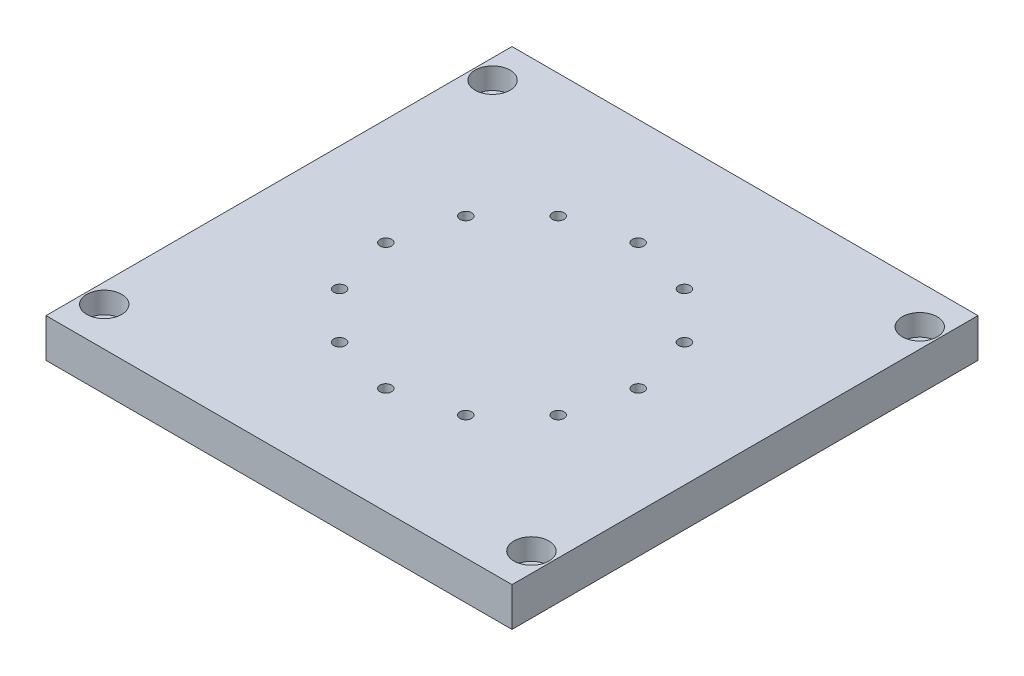
ISO-10303-21;
HEADER;
FILE_DESCRIPTION(('STEP AP214'),'2;1');
FILE_NAME('part.step','',(''),(''),'','','');
FILE_SCHEMA(('AUTOMOTIVE_DESIGN { 1 0 10303 214 1 1 1 1 }'));
ENDSEC;
DATA;
#1=APPLICATION_CONTEXT('core data for automotive mechanical design processes');
#2=APPLICATION_PROTOCOL_DEFINITION('international standard','automotive_design',2000,#1);
#3=PRODUCT_CONTEXT('',#1,'mechanical');
#4=PRODUCT('Part','Part','',(#3));
#5=PRODUCT_RELATED_PRODUCT_CATEGORY('part','',(#4));
#6=PRODUCT_DEFINITION_FORMATION('','',#4);
#7=PRODUCT_DEFINITION_CONTEXT('part definition',#1,'design');
#8=PRODUCT_DEFINITION('design','',#6,#7);
#9=PRODUCT_DEFINITION_SHAPE('','',#8);
#10=(LENGTH_UNIT() NAMED_UNIT(*) SI_UNIT(.MILLI.,.METRE.));
#11=(NAMED_UNIT(*) PLANE_ANGLE_UNIT() SI_UNIT($,.RADIAN.));
#12=(NAMED_UNIT(*) SI_UNIT($,.STERADIAN.) SOLID_ANGLE_UNIT());
#13=UNCERTAINTY_MEASURE_WITH_UNIT(LENGTH_MEASURE(1.E-05),#10,'distance_accuracy_value','');
#14=(GEOMETRIC_REPRESENTATION_CONTEXT(3) GLOBAL_UNCERTAINTY_ASSIGNED_CONTEXT((#13)) GLOBAL_UNIT_ASSIGNED_CONTEXT((#10,
#11,#12)) REPRESENTATION_CONTEXT('',''));
#15=CARTESIAN_POINT('',(0.,0.,0.));
#16=DIRECTION('',(0.,0.,1.));
#17=DIRECTION('',(1.,0.,0.));
#18=AXIS2_PLACEMENT_3D('',#15,#16,#17);
#19=CARTESIAN_POINT('',(0.,0.,0.));
#20=DIRECTION('',(0.,-1.,0.));
#21=DIRECTION('',(0.,0.,-1.));
#22=AXIS2_PLACEMENT_3D('',#19,#20,#21);
#23=PLANE('',#22);
#24=CARTESIAN_POINT('',(-56.2916512459881,0.,32.5000000000007));
#25=DIRECTION('',(0.,1.,0.));
#26=DIRECTION('',(0.,0.,1.));
#27=AXIS2_PLACEMENT_3D('',#24,#25,#26);
#28=CIRCLE('',#27,3.);
#29=CARTESIAN_POINT('',(-56.2916512459881,0.,35.5000000000007));
#30=VERTEX_POINT('',#29);
#31=EDGE_CURVE('E110',#30,#30,#28,.T.);
#32=ORIENTED_EDGE('',*,*,#31,.T.);
#33=EDGE_LOOP('',(#32));
#34=FACE_BOUND('',#33,.T.);
#35=CARTESIAN_POINT('',(-56.2916512459888,0.,-32.4999999999995));
#36=DIRECTION('',(0.,1.,0.));
#37=DIRECTION('',(0.,0.,1.));
#38=AXIS2_PLACEMENT_3D('',#35,#36,#37);
#39=CIRCLE('',#38,3.);
#40=CARTESIAN_POINT('',(-56.2916512459888,0.,-29.4999999999995));
#41=VERTEX_POINT('',#40);
#42=EDGE_CURVE('E122',#41,#41,#39,.T.);
#43=ORIENTED_EDGE('',*,*,#42,.T.);
#44=EDGE_LOOP('',(#43));
#45=FACE_BOUND('',#44,.T.);
#46=CARTESIAN_POINT('',(-32.5000000000005,0.,-56.2916512459882));
#47=DIRECTION('',(0.,1.,0.));
#48=DIRECTION('',(0.,0.,1.));
#49=AXIS2_PLACEMENT_3D('',#46,#47,#48);
#50=CIRCLE('',#49,3.);
#51=CARTESIAN_POINT('',(-32.5000000000005,0.,-53.2916512459882));
#52=VERTEX_POINT('',#51);
#53=EDGE_CURVE('E128',#52,#52,#50,.T.);
#54=ORIENTED_EDGE('',*,*,#53,.T.);
#55=EDGE_LOOP('',(#54));
#56=FACE_BOUND('',#55,.T.);
#57=CARTESIAN_POINT('',(0.,0.,-65.));
#58=DIRECTION('',(0.,1.,0.));
#59=DIRECTION('',(0.,0.,1.));
#60=AXIS2_PLACEMENT_3D('',#57,#58,#59);
#61=CIRCLE('',#60,3.);
#62=CARTESIAN_POINT('',(0.,0.,-62.));
#63=VERTEX_POINT('',#62);
#64=EDGE_CURVE('E134',#63,#63,#61,.T.);
#65=ORIENTED_EDGE('',*,*,#64,.T.);
#66=EDGE_LOOP('',(#65));
#67=FACE_BOUND('',#66,.T.);
#68=CARTESIAN_POINT('',(56.2916512459886,0.,32.5));
#69=DIRECTION('',(0.,1.,0.));
#70=DIRECTION('',(0.,0.,1.));
#71=AXIS2_PLACEMENT_3D('',#68,#69,#70);
#72=CIRCLE('',#71,3.);
#73=CARTESIAN_POINT('',(56.2916512459886,0.,35.5));
#74=VERTEX_POINT('',#73);
#75=EDGE_CURVE('E158',#74,#74,#72,.T.);
#76=ORIENTED_EDGE('',*,*,#75,.T.);
#77=EDGE_LOOP('',(#76));
#78=FACE_BOUND('',#77,.T.);
#79=CARTESIAN_POINT('',(32.5,0.,56.2916512459885));
#80=DIRECTION('',(0.,1.,0.));
#81=DIRECTION('',(0.,0.,1.));
#82=AXIS2_PLACEMENT_3D('',#79,#80,#81);
#83=CIRCLE('',#82,3.);
#84=CARTESIAN_POINT('',(32.5,0.,59.2916512459885));
#85=VERTEX_POINT('',#84);
#86=EDGE_CURVE('E164',#85,#85,#83,.T.);
#87=ORIENTED_EDGE('',*,*,#86,.T.);
#88=EDGE_LOOP('',(#87));
#89=FACE_BOUND('',#88,.T.);
#90=CARTESIAN_POINT('',(0.,0.,65.));
#91=DIRECTION('',(0.,1.,0.));
#92=DIRECTION('',(0.,0.,1.));
#93=AXIS2_PLACEMENT_3D('',#90,#91,#92);
#94=CIRCLE('',#93,3.);
#95=CARTESIAN_POINT('',(0.,0.,68.));
#96=VERTEX_POINT('',#95);
#97=EDGE_CURVE('E170',#96,#96,#94,.T.);
#98=ORIENTED_EDGE('',*,*,#97,.T.);
#99=EDGE_LOOP('',(#98));
#100=FACE_BOUND('',#99,.T.);
#101=CARTESIAN_POINT('',(110.,0.,100.));
#102=DIRECTION('',(0.,1.,0.));
#103=DIRECTION('',(0.,0.,1.));
#104=AXIS2_PLACEMENT_3D('',#101,#102,#103);
#105=CIRCLE('',#104,5.5);
#106=CARTESIAN_POINT('',(110.,0.,105.5));
#107=VERTEX_POINT('',#106);
#108=EDGE_CURVE('E182',#107,#107,#105,.T.);
#109=ORIENTED_EDGE('',*,*,#108,.T.);
#110=EDGE_LOOP('',(#109));
#111=FACE_BOUND('',#110,.T.);
#112=CARTESIAN_POINT('',(110.,0.,-100.));
#113=DIRECTION('',(0.,1.,0.));
#114=DIRECTION('',(0.,0.,1.));
#115=AXIS2_PLACEMENT_3D('',#112,#113,#114);
#116=CIRCLE('',#115,5.5);
#117=CARTESIAN_POINT('',(110.,0.,-94.5));
#118=VERTEX_POINT('',#117);
#119=EDGE_CURVE('E194',#118,#118,#116,.T.);
#120=ORIENTED_EDGE('',*,*,#119,.T.);
#121=EDGE_LOOP('',(#120));
#122=FACE_BOUND('',#121,.T.);
#123=CARTESIAN_POINT('',(-110.,0.,-100.));
#124=DIRECTION('',(0.,1.,0.));
#125=DIRECTION('',(0.,0.,1.));
#126=AXIS2_PLACEMENT_3D('',#123,#124,#125);
#127=CIRCLE('',#126,5.5);
#128=CARTESIAN_POINT('',(-110.,0.,-94.5));
#129=VERTEX_POINT('',#128);
#130=EDGE_CURVE('E206',#129,#129,#127,.T.);
#131=ORIENTED_EDGE('',*,*,#130,.T.);
#132=EDGE_LOOP('',(#131));
#133=FACE_BOUND('',#132,.T.);
#134=CARTESIAN_POINT('',(-110.,0.,100.));
#135=DIRECTION('',(0.,1.,0.));
#136=DIRECTION('',(0.,0.,1.));
#137=AXIS2_PLACEMENT_3D('',#134,#135,#136);
#138=CIRCLE('',#137,5.5);
#139=CARTESIAN_POINT('',(-110.,0.,105.5));
#140=VERTEX_POINT('',#139);
#141=EDGE_CURVE('E218',#140,#140,#138,.T.);
#142=ORIENTED_EDGE('',*,*,#141,.T.);
#143=EDGE_LOOP('',(#142));
#144=FACE_BOUND('',#143,.T.);
#145=DIRECTION('',(0.,0.,-1.));
#146=VECTOR('',#145,1.);
#147=CARTESIAN_POINT('',(120.,0.,120.));
#148=LINE('',#147,#146);
#149=CARTESIAN_POINT('',(120.,0.,120.));
#150=VERTEX_POINT('',#149);
#151=CARTESIAN_POINT('',(120.,0.,-120.));
#152=VERTEX_POINT('',#151);
#153=EDGE_CURVE('E221',#150,#152,#148,.T.);
#154=ORIENTED_EDGE('',*,*,#153,.F.);
#155=DIRECTION('',(1.,0.,0.));
#156=VECTOR('',#155,1.);
#157=CARTESIAN_POINT('',(-120.,0.,120.));
#158=LINE('',#157,#156);
#159=CARTESIAN_POINT('',(-120.,0.,120.));
#160=VERTEX_POINT('',#159);
#161=EDGE_CURVE('E58',#160,#150,#158,.T.);
#162=ORIENTED_EDGE('',*,*,#161,.F.);
#163=DIRECTION('',(0.,0.,1.));
#164=VECTOR('',#163,1.);
#165=CARTESIAN_POINT('',(-120.,0.,120.));
#166=LINE('',#165,#164);
#167=CARTESIAN_POINT('',(-120.,0.,-120.));
#168=VERTEX_POINT('',#167);
#169=EDGE_CURVE('E52',#168,#160,#166,.T.);
#170=ORIENTED_EDGE('',*,*,#169,.F.);
#171=DIRECTION('',(-1.,0.,0.));
#172=VECTOR('',#171,1.);
#173=CARTESIAN_POINT('',(-120.,0.,-120.));
#174=LINE('',#173,#172);
#175=EDGE_CURVE('E231',#152,#168,#174,.T.);
#176=ORIENTED_EDGE('',*,*,#175,.F.);
#177=EDGE_LOOP('',(#154,#162,#170,#176));
#178=FACE_BOUND('',#177,.T.);
#179=CARTESIAN_POINT('',(65.,0.,-2.34906491219262E-13));
#180=DIRECTION('',(0.,1.,0.));
#181=DIRECTION('',(0.,0.,1.));
#182=AXIS2_PLACEMENT_3D('',#179,#180,#181);
#183=CIRCLE('',#182,3.);
#184=CARTESIAN_POINT('',(65.,0.,2.99999999999977));
#185=VERTEX_POINT('',#184);
#186=EDGE_CURVE('E152',#185,#185,#183,.T.);
#187=ORIENTED_EDGE('',*,*,#186,.T.);
#188=EDGE_LOOP('',(#187));
#189=FACE_BOUND('',#188,.T.);
#190=CARTESIAN_POINT('',(56.2916512459884,0.,-32.5));
#191=DIRECTION('',(0.,1.,0.));
#192=DIRECTION('',(0.,0.,1.));
#193=AXIS2_PLACEMENT_3D('',#190,#191,#192);
#194=CIRCLE('',#193,3.);
#195=CARTESIAN_POINT('',(56.2916512459884,0.,-29.5));
#196=VERTEX_POINT('',#195);
#197=EDGE_CURVE('E146',#196,#196,#194,.T.);
#198=ORIENTED_EDGE('',*,*,#197,.T.);
#199=EDGE_LOOP('',(#198));
#200=FACE_BOUND('',#199,.T.);
#201=CARTESIAN_POINT('',(32.4999999999996,0.,-56.2916512459887));
#202=DIRECTION('',(0.,1.,0.));
#203=DIRECTION('',(0.,0.,1.));
#204=AXIS2_PLACEMENT_3D('',#201,#202,#203);
#205=CIRCLE('',#204,3.);
#206=CARTESIAN_POINT('',(32.4999999999996,0.,-53.2916512459887));
#207=VERTEX_POINT('',#206);
#208=EDGE_CURVE('E140',#207,#207,#205,.T.);
#209=ORIENTED_EDGE('',*,*,#208,.T.);
#210=EDGE_LOOP('',(#209));
#211=FACE_BOUND('',#210,.T.);
#212=CARTESIAN_POINT('',(-65.,0.,6.88799065268869E-13));
#213=DIRECTION('',(0.,1.,0.));
#214=DIRECTION('',(0.,0.,1.));
#215=AXIS2_PLACEMENT_3D('',#212,#213,#214);
#216=CIRCLE('',#215,3.);
#217=CARTESIAN_POINT('',(-65.,0.,3.00000000000069));
#218=VERTEX_POINT('',#217);
#219=EDGE_CURVE('E116',#218,#218,#216,.T.);
#220=ORIENTED_EDGE('',*,*,#219,.T.);
#221=EDGE_LOOP('',(#220));
#222=FACE_BOUND('',#221,.T.);
#223=CARTESIAN_POINT('',(-32.4999999999993,0.,56.2916512459889));
#224=DIRECTION('',(0.,1.,0.));
#225=DIRECTION('',(0.,0.,1.));
#226=AXIS2_PLACEMENT_3D('',#223,#224,#225);
#227=CIRCLE('',#226,3.);
#228=CARTESIAN_POINT('',(-32.4999999999993,0.,59.2916512459889));
#229=VERTEX_POINT('',#228);
#230=EDGE_CURVE('E104',#229,#229,#227,.T.);
#231=ORIENTED_EDGE('',*,*,#230,.T.);
#232=EDGE_LOOP('',(#231));
#233=FACE_BOUND('',#232,.T.);
#234=ADVANCED_FACE('F17',(#34,#45,#56,#67,#78,#89,#100,#111,#122,#133,#144,#178,#189,#200,#211,
#222,#233),#23,.T.);
#235=CARTESIAN_POINT('',(0.,20.,0.));
#236=DIRECTION('',(0.,-1.,0.));
#237=DIRECTION('',(0.,0.,-1.));
#238=AXIS2_PLACEMENT_3D('',#235,#236,#237);
#239=PLANE('',#238);
#240=CARTESIAN_POINT('',(-56.2916512459881,20.,32.5000000000007));
#241=DIRECTION('',(0.,1.,0.));
#242=DIRECTION('',(0.,0.,1.));
#243=AXIS2_PLACEMENT_3D('',#240,#241,#242);
#244=CIRCLE('',#243,3.);
#245=CARTESIAN_POINT('',(-56.2916512459881,20.,35.5000000000007));
#246=VERTEX_POINT('',#245);
#247=EDGE_CURVE('E107',#246,#246,#244,.T.);
#248=ORIENTED_EDGE('',*,*,#247,.F.);
#249=EDGE_LOOP('',(#248));
#250=FACE_BOUND('',#249,.T.);
#251=CARTESIAN_POINT('',(-56.2916512459888,20.,-32.4999999999995));
#252=DIRECTION('',(0.,1.,0.));
#253=DIRECTION('',(0.,0.,1.));
#254=AXIS2_PLACEMENT_3D('',#251,#252,#253);
#255=CIRCLE('',#254,3.);
#256=CARTESIAN_POINT('',(-56.2916512459888,20.,-29.4999999999995));
#257=VERTEX_POINT('',#256);
#258=EDGE_CURVE('E119',#257,#257,#255,.T.);
#259=ORIENTED_EDGE('',*,*,#258,.F.);
#260=EDGE_LOOP('',(#259));
#261=FACE_BOUND('',#260,.T.);
#262=CARTESIAN_POINT('',(0.,20.,-65.));
#263=DIRECTION('',(0.,1.,0.));
#264=DIRECTION('',(0.,0.,1.));
#265=AXIS2_PLACEMENT_3D('',#262,#263,#264);
#266=CIRCLE('',#265,3.);
#267=CARTESIAN_POINT('',(0.,20.,-62.));
#268=VERTEX_POINT('',#267);
#269=EDGE_CURVE('E131',#268,#268,#266,.T.);
#270=ORIENTED_EDGE('',*,*,#269,.F.);
#271=EDGE_LOOP('',(#270));
#272=FACE_BOUND('',#271,.T.);
#273=CARTESIAN_POINT('',(32.4999999999996,20.,-56.2916512459887));
#274=DIRECTION('',(0.,1.,0.));
#275=DIRECTION('',(0.,0.,1.));
#276=AXIS2_PLACEMENT_3D('',#273,#274,#275);
#277=CIRCLE('',#276,3.);
#278=CARTESIAN_POINT('',(32.4999999999996,20.,-53.2916512459887));
#279=VERTEX_POINT('',#278);
#280=EDGE_CURVE('E137',#279,#279,#277,.T.);
#281=ORIENTED_EDGE('',*,*,#280,.F.);
#282=EDGE_LOOP('',(#281));
#283=FACE_BOUND('',#282,.T.);
#284=CARTESIAN_POINT('',(65.,20.,-2.34906491219262E-13));
#285=DIRECTION('',(0.,1.,0.));
#286=DIRECTION('',(0.,0.,1.));
#287=AXIS2_PLACEMENT_3D('',#284,#285,#286);
#288=CIRCLE('',#287,3.);
#289=CARTESIAN_POINT('',(65.,20.,2.99999999999977));
#290=VERTEX_POINT('',#289);
#291=EDGE_CURVE('E149',#290,#290,#288,.T.);
#292=ORIENTED_EDGE('',*,*,#291,.F.);
#293=EDGE_LOOP('',(#292));
#294=FACE_BOUND('',#293,.T.);
#295=CARTESIAN_POINT('',(56.2916512459886,20.,32.5));
#296=DIRECTION('',(0.,1.,0.));
#297=DIRECTION('',(0.,0.,1.));
#298=AXIS2_PLACEMENT_3D('',#295,#296,#297);
#299=CIRCLE('',#298,3.);
#300=CARTESIAN_POINT('',(56.2916512459886,20.,35.5));
#301=VERTEX_POINT('',#300);
#302=EDGE_CURVE('E155',#301,#301,#299,.T.);
#303=ORIENTED_EDGE('',*,*,#302,.F.);
#304=EDGE_LOOP('',(#303));
#305=FACE_BOUND('',#304,.T.);
#306=CARTESIAN_POINT('',(32.5,20.,56.2916512459885));
#307=DIRECTION('',(0.,1.,0.));
#308=DIRECTION('',(0.,0.,1.));
#309=AXIS2_PLACEMENT_3D('',#306,#307,#308);
#310=CIRCLE('',#309,3.);
#311=CARTESIAN_POINT('',(32.5,20.,59.2916512459885));
#312=VERTEX_POINT('',#311);
#313=EDGE_CURVE('E161',#312,#312,#310,.T.);
#314=ORIENTED_EDGE('',*,*,#313,.F.);
#315=EDGE_LOOP('',(#314));
#316=FACE_BOUND('',#315,.T.);
#317=CARTESIAN_POINT('',(0.,20.,65.));
#318=DIRECTION('',(0.,1.,0.));
#319=DIRECTION('',(0.,0.,1.));
#320=AXIS2_PLACEMENT_3D('',#317,#318,#319);
#321=CIRCLE('',#320,3.);
#322=CARTESIAN_POINT('',(0.,20.,68.));
#323=VERTEX_POINT('',#322);
#324=EDGE_CURVE('E167',#323,#323,#321,.T.);
#325=ORIENTED_EDGE('',*,*,#324,.F.);
#326=EDGE_LOOP('',(#325));
#327=FACE_BOUND('',#326,.T.);
#328=CARTESIAN_POINT('',(110.,20.,100.));
#329=DIRECTION('',(0.,1.,0.));
#330=DIRECTION('',(0.,0.,1.));
#331=AXIS2_PLACEMENT_3D('',#328,#329,#330);
#332=CIRCLE('',#331,9.);
#333=CARTESIAN_POINT('',(110.,20.,109.));
#334=VERTEX_POINT('',#333);
#335=EDGE_CURVE('E173',#334,#334,#332,.T.);
#336=ORIENTED_EDGE('',*,*,#335,.F.);
#337=EDGE_LOOP('',(#336));
#338=FACE_BOUND('',#337,.T.);
#339=CARTESIAN_POINT('',(110.,20.,-100.));
#340=DIRECTION('',(0.,1.,0.));
#341=DIRECTION('',(0.,0.,1.));
#342=AXIS2_PLACEMENT_3D('',#339,#340,#341);
#343=CIRCLE('',#342,9.);
#344=CARTESIAN_POINT('',(110.,20.,-91.));
#345=VERTEX_POINT('',#344);
#346=EDGE_CURVE('E185',#345,#345,#343,.T.);
#347=ORIENTED_EDGE('',*,*,#346,.F.);
#348=EDGE_LOOP('',(#347));
#349=FACE_BOUND('',#348,.T.);
#350=CARTESIAN_POINT('',(-110.,20.,-100.));
#351=DIRECTION('',(0.,1.,0.));
#352=DIRECTION('',(0.,0.,1.));
#353=AXIS2_PLACEMENT_3D('',#350,#351,#352);
#354=CIRCLE('',#353,9.);
#355=CARTESIAN_POINT('',(-110.,20.,-91.));
#356=VERTEX_POINT('',#355);
#357=EDGE_CURVE('E197',#356,#356,#354,.T.);
#358=ORIENTED_EDGE('',*,*,#357,.F.);
#359=EDGE_LOOP('',(#358));
#360=FACE_BOUND('',#359,.T.);
#361=CARTESIAN_POINT('',(-110.,20.,100.));
#362=DIRECTION('',(0.,1.,0.));
#363=DIRECTION('',(0.,0.,1.));
#364=AXIS2_PLACEMENT_3D('',#361,#362,#363);
#365=CIRCLE('',#364,9.);
#366=CARTESIAN_POINT('',(-110.,20.,109.));
#367=VERTEX_POINT('',#366);
#368=EDGE_CURVE('E209',#367,#367,#365,.T.);
#369=ORIENTED_EDGE('',*,*,#368,.F.);
#370=EDGE_LOOP('',(#369));
#371=FACE_BOUND('',#370,.T.);
#372=DIRECTION('',(0.,0.,-1.));
#373=VECTOR('',#372,1.);
#374=CARTESIAN_POINT('',(120.,20.,120.));
#375=LINE('',#374,#373);
#376=CARTESIAN_POINT('',(120.,20.,120.));
#377=VERTEX_POINT('',#376);
#378=CARTESIAN_POINT('',(120.,20.,-120.));
#379=VERTEX_POINT('',#378);
#380=EDGE_CURVE('E222',#377,#379,#375,.T.);
#381=ORIENTED_EDGE('',*,*,#380,.T.);
#382=DIRECTION('',(-1.,0.,0.));
#383=VECTOR('',#382,1.);
#384=CARTESIAN_POINT('',(-120.,20.,-120.));
#385=LINE('',#384,#383);
#386=CARTESIAN_POINT('',(-120.,20.,-120.));
#387=VERTEX_POINT('',#386);
#388=EDGE_CURVE('E65',#379,#387,#385,.T.);
#389=ORIENTED_EDGE('',*,*,#388,.T.);
#390=DIRECTION('',(0.,0.,1.));
#391=VECTOR('',#390,1.);
#392=CARTESIAN_POINT('',(-120.,20.,120.));
#393=LINE('',#392,#391);
#394=CARTESIAN_POINT('',(-120.,20.,120.));
#395=VERTEX_POINT('',#394);
#396=EDGE_CURVE('E225',#387,#395,#393,.T.);
#397=ORIENTED_EDGE('',*,*,#396,.T.);
#398=DIRECTION('',(1.,0.,0.));
#399=VECTOR('',#398,1.);
#400=CARTESIAN_POINT('',(-120.,20.,120.));
#401=LINE('',#400,#399);
#402=EDGE_CURVE('E34',#395,#377,#401,.T.);
#403=ORIENTED_EDGE('',*,*,#402,.T.);
#404=EDGE_LOOP('',(#381,#389,#397,#403));
#405=FACE_BOUND('',#404,.T.);
#406=CARTESIAN_POINT('',(56.2916512459884,20.,-32.5));
#407=DIRECTION('',(0.,1.,0.));
#408=DIRECTION('',(0.,0.,1.));
#409=AXIS2_PLACEMENT_3D('',#406,#407,#408);
#410=CIRCLE('',#409,3.);
#411=CARTESIAN_POINT('',(56.2916512459884,20.,-29.5));
#412=VERTEX_POINT('',#411);
#413=EDGE_CURVE('E143',#412,#412,#410,.T.);
#414=ORIENTED_EDGE('',*,*,#413,.F.);
#415=EDGE_LOOP('',(#414));
#416=FACE_BOUND('',#415,.T.);
#417=CARTESIAN_POINT('',(-32.5000000000005,20.,-56.2916512459882));
#418=DIRECTION('',(0.,1.,0.));
#419=DIRECTION('',(0.,0.,1.));
#420=AXIS2_PLACEMENT_3D('',#417,#418,#419);
#421=CIRCLE('',#420,3.);
#422=CARTESIAN_POINT('',(-32.5000000000005,20.,-53.2916512459882));
#423=VERTEX_POINT('',#422);
#424=EDGE_CURVE('E125',#423,#423,#421,.T.);
#425=ORIENTED_EDGE('',*,*,#424,.F.);
#426=EDGE_LOOP('',(#425));
#427=FACE_BOUND('',#426,.T.);
#428=CARTESIAN_POINT('',(-65.,20.,6.88799065268869E-13));
#429=DIRECTION('',(0.,1.,0.));
#430=DIRECTION('',(0.,0.,1.));
#431=AXIS2_PLACEMENT_3D('',#428,#429,#430);
#432=CIRCLE('',#431,3.);
#433=CARTESIAN_POINT('',(-65.,20.,3.00000000000069));
#434=VERTEX_POINT('',#433);
#435=EDGE_CURVE('E113',#434,#434,#432,.T.);
#436=ORIENTED_EDGE('',*,*,#435,.F.);
#437=EDGE_LOOP('',(#436));
#438=FACE_BOUND('',#437,.T.);
#439=CARTESIAN_POINT('',(-32.4999999999993,20.,56.2916512459889));
#440=DIRECTION('',(0.,1.,0.));
#441=DIRECTION('',(0.,0.,1.));
#442=AXIS2_PLACEMENT_3D('',#439,#440,#441);
#443=CIRCLE('',#442,3.);
#444=CARTESIAN_POINT('',(-32.4999999999993,20.,59.2916512459889));
#445=VERTEX_POINT('',#444);
#446=EDGE_CURVE('E101',#445,#445,#443,.T.);
#447=ORIENTED_EDGE('',*,*,#446,.F.);
#448=EDGE_LOOP('',(#447));
#449=FACE_BOUND('',#448,.T.);
#450=ADVANCED_FACE('F263',(#250,#261,#272,#283,#294,#305,#316,#327,#338,#349,#360,#371,#405,
#416,#427,#438,#449),#239,.F.);
#451=CARTESIAN_POINT('',(120.,20.,120.));
#452=DIRECTION('',(-1.,0.,0.));
#453=DIRECTION('',(0.,0.,1.));
#454=AXIS2_PLACEMENT_3D('',#451,#452,#453);
#455=PLANE('',#454);
#456=ORIENTED_EDGE('',*,*,#153,.T.);
#457=DIRECTION('',(0.,-1.,0.));
#458=VECTOR('',#457,1.);
#459=CARTESIAN_POINT('',(120.,20.,-120.));
#460=LINE('',#459,#458);
#461=EDGE_CURVE('E11',#379,#152,#460,.T.);
#462=ORIENTED_EDGE('',*,*,#461,.F.);
#463=ORIENTED_EDGE('',*,*,#380,.F.);
#464=DIRECTION('',(0.,-1.,0.));
#465=VECTOR('',#464,1.);
#466=CARTESIAN_POINT('',(120.,20.,120.));
#467=LINE('',#466,#465);
#468=EDGE_CURVE('E228',#377,#150,#467,.T.);
#469=ORIENTED_EDGE('',*,*,#468,.T.);
#470=EDGE_LOOP('',(#456,#462,#463,#469));
#471=FACE_BOUND('',#470,.T.);
#472=ADVANCED_FACE('F19',(#471),#455,.F.);
#473=CARTESIAN_POINT('',(-120.,20.,-120.));
#474=DIRECTION('',(0.,0.,1.));
#475=DIRECTION('',(1.,0.,0.));
#476=AXIS2_PLACEMENT_3D('',#473,#474,#475);
#477=PLANE('',#476);
#478=ORIENTED_EDGE('',*,*,#175,.T.);
#479=DIRECTION('',(0.,-1.,0.));
#480=VECTOR('',#479,1.);
#481=CARTESIAN_POINT('',(-120.,20.,-120.));
#482=LINE('',#481,#480);
#483=EDGE_CURVE('E26',#387,#168,#482,.T.);
#484=ORIENTED_EDGE('',*,*,#483,.F.);
#485=ORIENTED_EDGE('',*,*,#388,.F.);
#486=ORIENTED_EDGE('',*,*,#461,.T.);
#487=EDGE_LOOP('',(#478,#484,#485,#486));
#488=FACE_BOUND('',#487,.T.);
#489=ADVANCED_FACE('F258',(#488),#477,.F.);
#490=CARTESIAN_POINT('',(-120.,20.,120.));
#491=DIRECTION('',(1.,0.,0.));
#492=DIRECTION('',(0.,0.,-1.));
#493=AXIS2_PLACEMENT_3D('',#490,#491,#492);
#494=PLANE('',#493);
#495=CARTESIAN_POINT('',(-120.,10.,-2.));
#496=DIRECTION('',(-1.,0.,0.));
#497=DIRECTION('',(0.,0.,1.));
#498=AXIS2_PLACEMENT_3D('',#495,#496,#497);
#499=CIRCLE('',#498,3.);
#500=CARTESIAN_POINT('',(-120.,10.,1.));
#501=VERTEX_POINT('',#500);
#502=EDGE_CURVE('E396',#501,#501,#499,.T.);
#503=ORIENTED_EDGE('',*,*,#502,.F.);
#504=EDGE_LOOP('',(#503));
#505=FACE_BOUND('',#504,.T.);
#506=CARTESIAN_POINT('',(-120.,10.,-66.));
#507=DIRECTION('',(-1.,0.,0.));
#508=DIRECTION('',(0.,0.,1.));
#509=AXIS2_PLACEMENT_3D('',#506,#507,#508);
#510=CIRCLE('',#509,3.);
#511=CARTESIAN_POINT('',(-120.,10.,-63.));
#512=VERTEX_POINT('',#511);
#513=EDGE_CURVE('E82',#512,#512,#510,.T.);
#514=ORIENTED_EDGE('',*,*,#513,.F.);
#515=EDGE_LOOP('',(#514));
#516=FACE_BOUND('',#515,.T.);
#517=ORIENTED_EDGE('',*,*,#169,.T.);
#518=DIRECTION('',(0.,-1.,0.));
#519=VECTOR('',#518,1.);
#520=CARTESIAN_POINT('',(-120.,20.,120.));
#521=LINE('',#520,#519);
#522=EDGE_CURVE('E236',#395,#160,#521,.T.);
#523=ORIENTED_EDGE('',*,*,#522,.F.);
#524=ORIENTED_EDGE('',*,*,#396,.F.);
#525=ORIENTED_EDGE('',*,*,#483,.T.);
#526=EDGE_LOOP('',(#517,#523,#524,#525));
#527=FACE_BOUND('',#526,.T.);
#528=ADVANCED_FACE('F238',(#505,#516,#527),#494,.F.);
#529=CARTESIAN_POINT('',(-120.,20.,120.));
#530=DIRECTION('',(0.,0.,-1.));
#531=DIRECTION('',(-1.,0.,0.));
#532=AXIS2_PLACEMENT_3D('',#529,#530,#531);
#533=PLANE('',#532);
#534=ORIENTED_EDGE('',*,*,#161,.T.);
#535=ORIENTED_EDGE('',*,*,#468,.F.);
#536=ORIENTED_EDGE('',*,*,#402,.F.);
#537=ORIENTED_EDGE('',*,*,#522,.T.);
#538=EDGE_LOOP('',(#534,#535,#536,#537));
#539=FACE_BOUND('',#538,.T.);
#540=ADVANCED_FACE('F245',(#539),#533,.F.);
#541=CARTESIAN_POINT('',(-110.,20.,100.));
#542=DIRECTION('',(0.,1.,0.));
#543=DIRECTION('',(0.,0.,1.));
#544=AXIS2_PLACEMENT_3D('',#541,#542,#543);
#545=CYLINDRICAL_SURFACE('',#544,5.5);
#546=ORIENTED_EDGE('',*,*,#141,.F.);
#547=EDGE_LOOP('',(#546));
#548=FACE_BOUND('',#547,.T.);
#549=CARTESIAN_POINT('',(-110.,9.,100.));
#550=DIRECTION('',(0.,1.,0.));
#551=DIRECTION('',(0.,0.,1.));
#552=AXIS2_PLACEMENT_3D('',#549,#550,#551);
#553=CIRCLE('',#552,5.5);
#554=CARTESIAN_POINT('',(-110.,9.,105.5));
#555=VERTEX_POINT('',#554);
#556=EDGE_CURVE('E215',#555,#555,#553,.T.);
#557=ORIENTED_EDGE('',*,*,#556,.T.);
#558=EDGE_LOOP('',(#557));
#559=FACE_BOUND('',#558,.T.);
#560=ADVANCED_FACE('F247',(#548,#559),#545,.F.);
#561=CARTESIAN_POINT('',(-104.5,9.,100.));
#562=DIRECTION('',(0.,-1.,0.));
#563=DIRECTION('',(0.,0.,-1.));
#564=AXIS2_PLACEMENT_3D('',#561,#562,#563);
#565=PLANE('',#564);
#566=ORIENTED_EDGE('',*,*,#556,.F.);
#567=EDGE_LOOP('',(#566));
#568=FACE_BOUND('',#567,.T.);
#569=CARTESIAN_POINT('',(-110.,9.,100.));
#570=DIRECTION('',(0.,1.,0.));
#571=DIRECTION('',(0.,0.,1.));
#572=AXIS2_PLACEMENT_3D('',#569,#570,#571);
#573=CIRCLE('',#572,9.);
#574=CARTESIAN_POINT('',(-110.,9.,109.));
#575=VERTEX_POINT('',#574);
#576=EDGE_CURVE('E212',#575,#575,#573,.T.);
#577=ORIENTED_EDGE('',*,*,#576,.T.);
#578=EDGE_LOOP('',(#577));
#579=FACE_BOUND('',#578,.T.);
#580=ADVANCED_FACE('F255',(#568,#579),#565,.F.);
#581=CARTESIAN_POINT('',(-110.,20.,100.));
#582=DIRECTION('',(0.,1.,0.));
#583=DIRECTION('',(0.,0.,1.));
#584=AXIS2_PLACEMENT_3D('',#581,#582,#583);
#585=CYLINDRICAL_SURFACE('',#584,9.);
#586=ORIENTED_EDGE('',*,*,#576,.F.);
#587=EDGE_LOOP('',(#586));
#588=FACE_BOUND('',#587,.T.);
#589=ORIENTED_EDGE('',*,*,#368,.T.);
#590=EDGE_LOOP('',(#589));
#591=FACE_BOUND('',#590,.T.);
#592=ADVANCED_FACE('F275',(#588,#591),#585,.F.);
#593=CARTESIAN_POINT('',(-110.,20.,-100.));
#594=DIRECTION('',(0.,1.,0.));
#595=DIRECTION('',(0.,0.,1.));
#596=AXIS2_PLACEMENT_3D('',#593,#594,#595);
#597=CYLINDRICAL_SURFACE('',#596,5.5);
#598=ORIENTED_EDGE('',*,*,#130,.F.);
#599=EDGE_LOOP('',(#598));
#600=FACE_BOUND('',#599,.T.);
#601=CARTESIAN_POINT('',(-110.,9.,-100.));
#602=DIRECTION('',(0.,1.,0.));
#603=DIRECTION('',(0.,0.,1.));
#604=AXIS2_PLACEMENT_3D('',#601,#602,#603);
#605=CIRCLE('',#604,5.5);
#606=CARTESIAN_POINT('',(-110.,9.,-94.5));
#607=VERTEX_POINT('',#606);
#608=EDGE_CURVE('E203',#607,#607,#605,.T.);
#609=ORIENTED_EDGE('',*,*,#608,.T.);
#610=EDGE_LOOP('',(#609));
#611=FACE_BOUND('',#610,.T.);
#612=ADVANCED_FACE('F279',(#600,#611),#597,.F.);
#613=CARTESIAN_POINT('',(-104.5,9.,-100.));
#614=DIRECTION('',(0.,-1.,0.));
#615=DIRECTION('',(0.,0.,-1.));
#616=AXIS2_PLACEMENT_3D('',#613,#614,#615);
#617=PLANE('',#616);
#618=ORIENTED_EDGE('',*,*,#608,.F.);
#619=EDGE_LOOP('',(#618));
#620=FACE_BOUND('',#619,.T.);
#621=CARTESIAN_POINT('',(-110.,9.,-100.));
#622=DIRECTION('',(0.,1.,0.));
#623=DIRECTION('',(0.,0.,1.));
#624=AXIS2_PLACEMENT_3D('',#621,#622,#623);
#625=CIRCLE('',#624,9.);
#626=CARTESIAN_POINT('',(-110.,9.,-91.));
#627=VERTEX_POINT('',#626);
#628=EDGE_CURVE('E200',#627,#627,#625,.T.);
#629=ORIENTED_EDGE('',*,*,#628,.T.);
#630=EDGE_LOOP('',(#629));
#631=FACE_BOUND('',#630,.T.);
#632=ADVANCED_FACE('F283',(#620,#631),#617,.F.);
#633=CARTESIAN_POINT('',(-110.,20.,-100.));
#634=DIRECTION('',(0.,1.,0.));
#635=DIRECTION('',(0.,0.,1.));
#636=AXIS2_PLACEMENT_3D('',#633,#634,#635);
#637=CYLINDRICAL_SURFACE('',#636,9.);
#638=ORIENTED_EDGE('',*,*,#628,.F.);
#639=EDGE_LOOP('',(#638));
#640=FACE_BOUND('',#639,.T.);
#641=ORIENTED_EDGE('',*,*,#357,.T.);
#642=EDGE_LOOP('',(#641));
#643=FACE_BOUND('',#642,.T.);
#644=ADVANCED_FACE('F287',(#640,#643),#637,.F.);
#645=CARTESIAN_POINT('',(110.,20.,-100.));
#646=DIRECTION('',(0.,1.,0.));
#647=DIRECTION('',(0.,0.,1.));
#648=AXIS2_PLACEMENT_3D('',#645,#646,#647);
#649=CYLINDRICAL_SURFACE('',#648,5.5);
#650=ORIENTED_EDGE('',*,*,#119,.F.);
#651=EDGE_LOOP('',(#650));
#652=FACE_BOUND('',#651,.T.);
#653=CARTESIAN_POINT('',(110.,9.,-100.));
#654=DIRECTION('',(0.,1.,0.));
#655=DIRECTION('',(0.,0.,1.));
#656=AXIS2_PLACEMENT_3D('',#653,#654,#655);
#657=CIRCLE('',#656,5.5);
#658=CARTESIAN_POINT('',(110.,9.,-94.5));
#659=VERTEX_POINT('',#658);
#660=EDGE_CURVE('E191',#659,#659,#657,.T.);
#661=ORIENTED_EDGE('',*,*,#660,.T.);
#662=EDGE_LOOP('',(#661));
#663=FACE_BOUND('',#662,.T.);
#664=ADVANCED_FACE('F291',(#652,#663),#649,.F.);
#665=CARTESIAN_POINT('',(115.5,9.,-100.));
#666=DIRECTION('',(0.,-1.,0.));
#667=DIRECTION('',(0.,0.,-1.));
#668=AXIS2_PLACEMENT_3D('',#665,#666,#667);
#669=PLANE('',#668);
#670=ORIENTED_EDGE('',*,*,#660,.F.);
#671=EDGE_LOOP('',(#670));
#672=FACE_BOUND('',#671,.T.);
#673=CARTESIAN_POINT('',(110.,9.,-100.));
#674=DIRECTION('',(0.,1.,0.));
#675=DIRECTION('',(0.,0.,1.));
#676=AXIS2_PLACEMENT_3D('',#673,#674,#675);
#677=CIRCLE('',#676,9.);
#678=CARTESIAN_POINT('',(110.,9.,-91.));
#679=VERTEX_POINT('',#678);
#680=EDGE_CURVE('E188',#679,#679,#677,.T.);
#681=ORIENTED_EDGE('',*,*,#680,.T.);
#682=EDGE_LOOP('',(#681));
#683=FACE_BOUND('',#682,.T.);
#684=ADVANCED_FACE('F295',(#672,#683),#669,.F.);
#685=CARTESIAN_POINT('',(110.,20.,-100.));
#686=DIRECTION('',(0.,1.,0.));
#687=DIRECTION('',(0.,0.,1.));
#688=AXIS2_PLACEMENT_3D('',#685,#686,#687);
#689=CYLINDRICAL_SURFACE('',#688,9.);
#690=ORIENTED_EDGE('',*,*,#680,.F.);
#691=EDGE_LOOP('',(#690));
#692=FACE_BOUND('',#691,.T.);
#693=ORIENTED_EDGE('',*,*,#346,.T.);
#694=EDGE_LOOP('',(#693));
#695=FACE_BOUND('',#694,.T.);
#696=ADVANCED_FACE('F299',(#692,#695),#689,.F.);
#697=CARTESIAN_POINT('',(110.,20.,100.));
#698=DIRECTION('',(0.,1.,0.));
#699=DIRECTION('',(0.,0.,1.));
#700=AXIS2_PLACEMENT_3D('',#697,#698,#699);
#701=CYLINDRICAL_SURFACE('',#700,5.5);
#702=ORIENTED_EDGE('',*,*,#108,.F.);
#703=EDGE_LOOP('',(#702));
#704=FACE_BOUND('',#703,.T.);
#705=CARTESIAN_POINT('',(110.,9.,100.));
#706=DIRECTION('',(0.,1.,0.));
#707=DIRECTION('',(0.,0.,1.));
#708=AXIS2_PLACEMENT_3D('',#705,#706,#707);
#709=CIRCLE('',#708,5.5);
#710=CARTESIAN_POINT('',(110.,9.,105.5));
#711=VERTEX_POINT('',#710);
#712=EDGE_CURVE('E179',#711,#711,#709,.T.);
#713=ORIENTED_EDGE('',*,*,#712,.T.);
#714=EDGE_LOOP('',(#713));
#715=FACE_BOUND('',#714,.T.);
#716=ADVANCED_FACE('F303',(#704,#715),#701,.F.);
#717=CARTESIAN_POINT('',(115.5,9.,100.));
#718=DIRECTION('',(0.,-1.,0.));
#719=DIRECTION('',(0.,0.,-1.));
#720=AXIS2_PLACEMENT_3D('',#717,#718,#719);
#721=PLANE('',#720);
#722=ORIENTED_EDGE('',*,*,#712,.F.);
#723=EDGE_LOOP('',(#722));
#724=FACE_BOUND('',#723,.T.);
#725=CARTESIAN_POINT('',(110.,9.,100.));
#726=DIRECTION('',(0.,1.,0.));
#727=DIRECTION('',(0.,0.,1.));
#728=AXIS2_PLACEMENT_3D('',#725,#726,#727);
#729=CIRCLE('',#728,9.);
#730=CARTESIAN_POINT('',(110.,9.,109.));
#731=VERTEX_POINT('',#730);
#732=EDGE_CURVE('E176',#731,#731,#729,.T.);
#733=ORIENTED_EDGE('',*,*,#732,.T.);
#734=EDGE_LOOP('',(#733));
#735=FACE_BOUND('',#734,.T.);
#736=ADVANCED_FACE('F307',(#724,#735),#721,.F.);
#737=CARTESIAN_POINT('',(110.,20.,100.));
#738=DIRECTION('',(0.,1.,0.));
#739=DIRECTION('',(0.,0.,1.));
#740=AXIS2_PLACEMENT_3D('',#737,#738,#739);
#741=CYLINDRICAL_SURFACE('',#740,9.);
#742=ORIENTED_EDGE('',*,*,#732,.F.);
#743=EDGE_LOOP('',(#742));
#744=FACE_BOUND('',#743,.T.);
#745=ORIENTED_EDGE('',*,*,#335,.T.);
#746=EDGE_LOOP('',(#745));
#747=FACE_BOUND('',#746,.T.);
#748=ADVANCED_FACE('F311',(#744,#747),#741,.F.);
#749=CARTESIAN_POINT('',(0.,20.,65.));
#750=DIRECTION('',(0.,1.,0.));
#751=DIRECTION('',(0.,0.,1.));
#752=AXIS2_PLACEMENT_3D('',#749,#750,#751);
#753=CYLINDRICAL_SURFACE('',#752,3.);
#754=ORIENTED_EDGE('',*,*,#97,.F.);
#755=EDGE_LOOP('',(#754));
#756=FACE_BOUND('',#755,.T.);
#757=ORIENTED_EDGE('',*,*,#324,.T.);
#758=EDGE_LOOP('',(#757));
#759=FACE_BOUND('',#758,.T.);
#760=ADVANCED_FACE('F315',(#756,#759),#753,.F.);
#761=CARTESIAN_POINT('',(32.5,20.,56.2916512459885));
#762=DIRECTION('',(0.,1.,0.));
#763=DIRECTION('',(0.,0.,1.));
#764=AXIS2_PLACEMENT_3D('',#761,#762,#763);
#765=CYLINDRICAL_SURFACE('',#764,3.);
#766=ORIENTED_EDGE('',*,*,#86,.F.);
#767=EDGE_LOOP('',(#766));
#768=FACE_BOUND('',#767,.T.);
#769=ORIENTED_EDGE('',*,*,#313,.T.);
#770=EDGE_LOOP('',(#769));
#771=FACE_BOUND('',#770,.T.);
#772=ADVANCED_FACE('F319',(#768,#771),#765,.F.);
#773=CARTESIAN_POINT('',(56.2916512459886,20.,32.5));
#774=DIRECTION('',(0.,1.,0.));
#775=DIRECTION('',(0.,0.,1.));
#776=AXIS2_PLACEMENT_3D('',#773,#774,#775);
#777=CYLINDRICAL_SURFACE('',#776,3.);
#778=ORIENTED_EDGE('',*,*,#75,.F.);
#779=EDGE_LOOP('',(#778));
#780=FACE_BOUND('',#779,.T.);
#781=ORIENTED_EDGE('',*,*,#302,.T.);
#782=EDGE_LOOP('',(#781));
#783=FACE_BOUND('',#782,.T.);
#784=ADVANCED_FACE('F323',(#780,#783),#777,.F.);
#785=CARTESIAN_POINT('',(65.,20.,-2.34906491219262E-13));
#786=DIRECTION('',(0.,1.,0.));
#787=DIRECTION('',(0.,0.,1.));
#788=AXIS2_PLACEMENT_3D('',#785,#786,#787);
#789=CYLINDRICAL_SURFACE('',#788,3.);
#790=ORIENTED_EDGE('',*,*,#186,.F.);
#791=EDGE_LOOP('',(#790));
#792=FACE_BOUND('',#791,.T.);
#793=ORIENTED_EDGE('',*,*,#291,.T.);
#794=EDGE_LOOP('',(#793));
#795=FACE_BOUND('',#794,.T.);
#796=ADVANCED_FACE('F327',(#792,#795),#789,.F.);
#797=CARTESIAN_POINT('',(56.2916512459884,20.,-32.5));
#798=DIRECTION('',(0.,1.,0.));
#799=DIRECTION('',(0.,0.,1.));
#800=AXIS2_PLACEMENT_3D('',#797,#798,#799);
#801=CYLINDRICAL_SURFACE('',#800,3.);
#802=ORIENTED_EDGE('',*,*,#197,.F.);
#803=EDGE_LOOP('',(#802));
#804=FACE_BOUND('',#803,.T.);
#805=ORIENTED_EDGE('',*,*,#413,.T.);
#806=EDGE_LOOP('',(#805));
#807=FACE_BOUND('',#806,.T.);
#808=ADVANCED_FACE('F331',(#804,#807),#801,.F.);
#809=CARTESIAN_POINT('',(32.4999999999996,20.,-56.2916512459887));
#810=DIRECTION('',(0.,1.,0.));
#811=DIRECTION('',(0.,0.,1.));
#812=AXIS2_PLACEMENT_3D('',#809,#810,#811);
#813=CYLINDRICAL_SURFACE('',#812,3.);
#814=ORIENTED_EDGE('',*,*,#208,.F.);
#815=EDGE_LOOP('',(#814));
#816=FACE_BOUND('',#815,.T.);
#817=ORIENTED_EDGE('',*,*,#280,.T.);
#818=EDGE_LOOP('',(#817));
#819=FACE_BOUND('',#818,.T.);
#820=ADVANCED_FACE('F335',(#816,#819),#813,.F.);
#821=CARTESIAN_POINT('',(0.,20.,-65.));
#822=DIRECTION('',(0.,1.,0.));
#823=DIRECTION('',(0.,0.,1.));
#824=AXIS2_PLACEMENT_3D('',#821,#822,#823);
#825=CYLINDRICAL_SURFACE('',#824,3.);
#826=ORIENTED_EDGE('',*,*,#64,.F.);
#827=EDGE_LOOP('',(#826));
#828=FACE_BOUND('',#827,.T.);
#829=ORIENTED_EDGE('',*,*,#269,.T.);
#830=EDGE_LOOP('',(#829));
#831=FACE_BOUND('',#830,.T.);
#832=ADVANCED_FACE('F339',(#828,#831),#825,.F.);
#833=CARTESIAN_POINT('',(-32.5000000000005,20.,-56.2916512459882));
#834=DIRECTION('',(0.,1.,0.));
#835=DIRECTION('',(0.,0.,1.));
#836=AXIS2_PLACEMENT_3D('',#833,#834,#835);
#837=CYLINDRICAL_SURFACE('',#836,3.);
#838=ORIENTED_EDGE('',*,*,#53,.F.);
#839=EDGE_LOOP('',(#838));
#840=FACE_BOUND('',#839,.T.);
#841=ORIENTED_EDGE('',*,*,#424,.T.);
#842=EDGE_LOOP('',(#841));
#843=FACE_BOUND('',#842,.T.);
#844=ADVANCED_FACE('F343',(#840,#843),#837,.F.);
#845=CARTESIAN_POINT('',(-56.2916512459888,20.,-32.4999999999995));
#846=DIRECTION('',(0.,1.,0.));
#847=DIRECTION('',(0.,0.,1.));
#848=AXIS2_PLACEMENT_3D('',#845,#846,#847);
#849=CYLINDRICAL_SURFACE('',#848,3.);
#850=ORIENTED_EDGE('',*,*,#42,.F.);
#851=EDGE_LOOP('',(#850));
#852=FACE_BOUND('',#851,.T.);
#853=ORIENTED_EDGE('',*,*,#258,.T.);
#854=EDGE_LOOP('',(#853));
#855=FACE_BOUND('',#854,.T.);
#856=ADVANCED_FACE('F347',(#852,#855),#849,.F.);
#857=CARTESIAN_POINT('',(-65.,20.,6.88799065268869E-13));
#858=DIRECTION('',(0.,1.,0.));
#859=DIRECTION('',(0.,0.,1.));
#860=AXIS2_PLACEMENT_3D('',#857,#858,#859);
#861=CYLINDRICAL_SURFACE('',#860,3.);
#862=ORIENTED_EDGE('',*,*,#219,.F.);
#863=EDGE_LOOP('',(#862));
#864=FACE_BOUND('',#863,.T.);
#865=ORIENTED_EDGE('',*,*,#435,.T.);
#866=EDGE_LOOP('',(#865));
#867=FACE_BOUND('',#866,.T.);
#868=ADVANCED_FACE('F351',(#864,#867),#861,.F.);
#869=CARTESIAN_POINT('',(-56.2916512459881,20.,32.5000000000007));
#870=DIRECTION('',(0.,1.,0.));
#871=DIRECTION('',(0.,0.,1.));
#872=AXIS2_PLACEMENT_3D('',#869,#870,#871);
#873=CYLINDRICAL_SURFACE('',#872,3.);
#874=ORIENTED_EDGE('',*,*,#31,.F.);
#875=EDGE_LOOP('',(#874));
#876=FACE_BOUND('',#875,.T.);
#877=ORIENTED_EDGE('',*,*,#247,.T.);
#878=EDGE_LOOP('',(#877));
#879=FACE_BOUND('',#878,.T.);
#880=ADVANCED_FACE('F355',(#876,#879),#873,.F.);
#881=CARTESIAN_POINT('',(-32.4999999999993,20.,56.2916512459889));
#882=DIRECTION('',(0.,1.,0.));
#883=DIRECTION('',(0.,0.,1.));
#884=AXIS2_PLACEMENT_3D('',#881,#882,#883);
#885=CYLINDRICAL_SURFACE('',#884,3.);
#886=ORIENTED_EDGE('',*,*,#230,.F.);
#887=EDGE_LOOP('',(#886));
#888=FACE_BOUND('',#887,.T.);
#889=ORIENTED_EDGE('',*,*,#446,.T.);
#890=EDGE_LOOP('',(#889));
#891=FACE_BOUND('',#890,.T.);
#892=ADVANCED_FACE('F359',(#888,#891),#885,.F.);
#893=CARTESIAN_POINT('',(-97.,10.,-66.));
#894=DIRECTION('',(-1.,0.,0.));
#895=DIRECTION('',(0.,0.,1.));
#896=AXIS2_PLACEMENT_3D('',#893,#894,#895);
#897=CONICAL_SURFACE('',#896,2.5,1.02974425867665);
#898=CARTESIAN_POINT('',(-95.4978484524311,10.,-66.));
#899=VERTEX_POINT('',#898);
#900=VERTEX_LOOP('',#899);
#901=FACE_BOUND('',#900,.T.);
#902=CARTESIAN_POINT('',(-97.,10.,-66.));
#903=DIRECTION('',(-1.,0.,0.));
#904=DIRECTION('',(0.,0.,1.));
#905=AXIS2_PLACEMENT_3D('',#902,#903,#904);
#906=CIRCLE('',#905,2.5);
#907=CARTESIAN_POINT('',(-97.,10.,-63.5));
#908=VERTEX_POINT('',#907);
#909=EDGE_CURVE('E98',#908,#908,#906,.T.);
#910=ORIENTED_EDGE('',*,*,#909,.T.);
#911=EDGE_LOOP('',(#910));
#912=FACE_BOUND('',#911,.T.);
#913=ADVANCED_FACE('F363',(#901,#912),#897,.F.);
#914=CARTESIAN_POINT('',(-120.,10.,-66.));
#915=DIRECTION('',(-1.,0.,0.));
#916=DIRECTION('',(0.,0.,1.));
#917=AXIS2_PLACEMENT_3D('',#914,#915,#916);
#918=CYLINDRICAL_SURFACE('',#917,2.5);
#919=ORIENTED_EDGE('',*,*,#909,.F.);
#920=EDGE_LOOP('',(#919));
#921=FACE_BOUND('',#920,.T.);
#922=CARTESIAN_POINT('',(-102.,10.,-66.));
#923=DIRECTION('',(-1.,0.,0.));
#924=DIRECTION('',(0.,0.,1.));
#925=AXIS2_PLACEMENT_3D('',#922,#923,#924);
#926=CIRCLE('',#925,2.5);
#927=CARTESIAN_POINT('',(-102.,10.,-63.5));
#928=VERTEX_POINT('',#927);
#929=EDGE_CURVE('E95',#928,#928,#926,.T.);
#930=ORIENTED_EDGE('',*,*,#929,.T.);
#931=EDGE_LOOP('',(#930));
#932=FACE_BOUND('',#931,.T.);
#933=ADVANCED_FACE('F367',(#921,#932),#918,.F.);
#934=CARTESIAN_POINT('',(-102.,12.5,-66.));
#935=DIRECTION('',(1.,0.,0.));
#936=DIRECTION('',(0.,0.,-1.));
#937=AXIS2_PLACEMENT_3D('',#934,#935,#936);
#938=PLANE('',#937);
#939=ORIENTED_EDGE('',*,*,#929,.F.);
#940=EDGE_LOOP('',(#939));
#941=FACE_BOUND('',#940,.T.);
#942=CARTESIAN_POINT('',(-102.,10.,-66.));
#943=DIRECTION('',(-1.,0.,0.));
#944=DIRECTION('',(0.,0.,1.));
#945=AXIS2_PLACEMENT_3D('',#942,#943,#944);
#946=CIRCLE('',#945,3.);
#947=CARTESIAN_POINT('',(-102.,10.,-63.));
#948=VERTEX_POINT('',#947);
#949=EDGE_CURVE('E86',#948,#948,#946,.T.);
#950=ORIENTED_EDGE('',*,*,#949,.T.);
#951=EDGE_LOOP('',(#950));
#952=FACE_BOUND('',#951,.T.);
#953=ADVANCED_FACE('F371',(#941,#952),#938,.F.);
#954=CARTESIAN_POINT('',(-120.,10.,-66.));
#955=DIRECTION('',(-1.,0.,0.));
#956=DIRECTION('',(0.,0.,1.));
#957=AXIS2_PLACEMENT_3D('',#954,#955,#956);
#958=CYLINDRICAL_SURFACE('',#957,3.);
#959=ORIENTED_EDGE('',*,*,#949,.F.);
#960=EDGE_LOOP('',(#959));
#961=FACE_BOUND('',#960,.T.);
#962=ORIENTED_EDGE('',*,*,#513,.T.);
#963=EDGE_LOOP('',(#962));
#964=FACE_BOUND('',#963,.T.);
#965=ADVANCED_FACE('F76',(#961,#964),#958,.F.);
#966=CARTESIAN_POINT('',(-97.,10.,-2.));
#967=DIRECTION('',(-1.,0.,0.));
#968=DIRECTION('',(0.,0.,1.));
#969=AXIS2_PLACEMENT_3D('',#966,#967,#968);
#970=CONICAL_SURFACE('',#969,2.5,1.02974425867665);
#971=CARTESIAN_POINT('',(-95.4978484524311,10.,-2.));
#972=VERTEX_POINT('',#971);
#973=VERTEX_LOOP('',#972);
#974=FACE_BOUND('',#973,.T.);
#975=CARTESIAN_POINT('',(-97.,10.,-2.));
#976=DIRECTION('',(-1.,0.,0.));
#977=DIRECTION('',(0.,0.,1.));
#978=AXIS2_PLACEMENT_3D('',#975,#976,#977);
#979=CIRCLE('',#978,2.5);
#980=CARTESIAN_POINT('',(-97.,10.,0.5));
#981=VERTEX_POINT('',#980);
#982=EDGE_CURVE('E80',#981,#981,#979,.T.);
#983=ORIENTED_EDGE('',*,*,#982,.T.);
#984=EDGE_LOOP('',(#983));
#985=FACE_BOUND('',#984,.T.);
#986=ADVANCED_FACE('F72',(#974,#985),#970,.F.);
#987=CARTESIAN_POINT('',(-120.,10.,-2.));
#988=DIRECTION('',(-1.,0.,0.));
#989=DIRECTION('',(0.,0.,1.));
#990=AXIS2_PLACEMENT_3D('',#987,#988,#989);
#991=CYLINDRICAL_SURFACE('',#990,2.5);
#992=ORIENTED_EDGE('',*,*,#982,.F.);
#993=EDGE_LOOP('',(#992));
#994=FACE_BOUND('',#993,.T.);
#995=CARTESIAN_POINT('',(-102.,10.,-2.));
#996=DIRECTION('',(-1.,0.,0.));
#997=DIRECTION('',(0.,0.,1.));
#998=AXIS2_PLACEMENT_3D('',#995,#996,#997);
#999=CIRCLE('',#998,2.5);
#1000=CARTESIAN_POINT('',(-102.,10.,0.5));
#1001=VERTEX_POINT('',#1000);
#1002=EDGE_CURVE('E83',#1001,#1001,#999,.T.);
#1003=ORIENTED_EDGE('',*,*,#1002,.T.);
#1004=EDGE_LOOP('',(#1003));
#1005=FACE_BOUND('',#1004,.T.);
#1006=ADVANCED_FACE('F75',(#994,#1005),#991,.F.);
#1007=CARTESIAN_POINT('',(-102.,12.5,-2.));
#1008=DIRECTION('',(1.,0.,0.));
#1009=DIRECTION('',(0.,0.,-1.));
#1010=AXIS2_PLACEMENT_3D('',#1007,#1008,#1009);
#1011=PLANE('',#1010);
#1012=ORIENTED_EDGE('',*,*,#1002,.F.);
#1013=EDGE_LOOP('',(#1012));
#1014=FACE_BOUND('',#1013,.T.);
#1015=CARTESIAN_POINT('',(-102.,10.,-2.));
#1016=DIRECTION('',(-1.,0.,0.));
#1017=DIRECTION('',(0.,0.,1.));
#1018=AXIS2_PLACEMENT_3D('',#1015,#1016,#1017);
#1019=CIRCLE('',#1018,3.);
#1020=CARTESIAN_POINT('',(-102.,10.,1.));
#1021=VERTEX_POINT('',#1020);
#1022=EDGE_CURVE('E89',#1021,#1021,#1019,.T.);
#1023=ORIENTED_EDGE('',*,*,#1022,.T.);
#1024=EDGE_LOOP('',(#1023));
#1025=FACE_BOUND('',#1024,.T.);
#1026=ADVANCED_FACE('F381',(#1014,#1025),#1011,.F.);
#1027=CARTESIAN_POINT('',(-120.,10.,-2.));
#1028=DIRECTION('',(-1.,0.,0.));
#1029=DIRECTION('',(0.,0.,1.));
#1030=AXIS2_PLACEMENT_3D('',#1027,#1028,#1029);
#1031=CYLINDRICAL_SURFACE('',#1030,3.);
#1032=ORIENTED_EDGE('',*,*,#1022,.F.);
#1033=EDGE_LOOP('',(#1032));
#1034=FACE_BOUND('',#1033,.T.);
#1035=ORIENTED_EDGE('',*,*,#502,.T.);
#1036=EDGE_LOOP('',(#1035));
#1037=FACE_BOUND('',#1036,.T.);
#1038=ADVANCED_FACE('F384',(#1034,#1037),#1031,.F.);
#1039=CLOSED_SHELL('',(#234,#450,#472,#489,#528,#540,#560,#580,#592,#612,#632,#644,#664,#684,
#696,#716,#736,#748,#760,#772,#784,#796,#808,#820,#832,#844,#856,#868,#880,#892,#913,#933,#953,
#965,#986,#1006,#1026,#1038));
#1040=MANIFOLD_SOLID_BREP('B1',#1039);
#1041=ADVANCED_BREP_SHAPE_REPRESENTATION('',(#18,#1040),#14);
#1042=SHAPE_DEFINITION_REPRESENTATION(#9,#1041);
ENDSEC;
END-ISO-10303-21;
